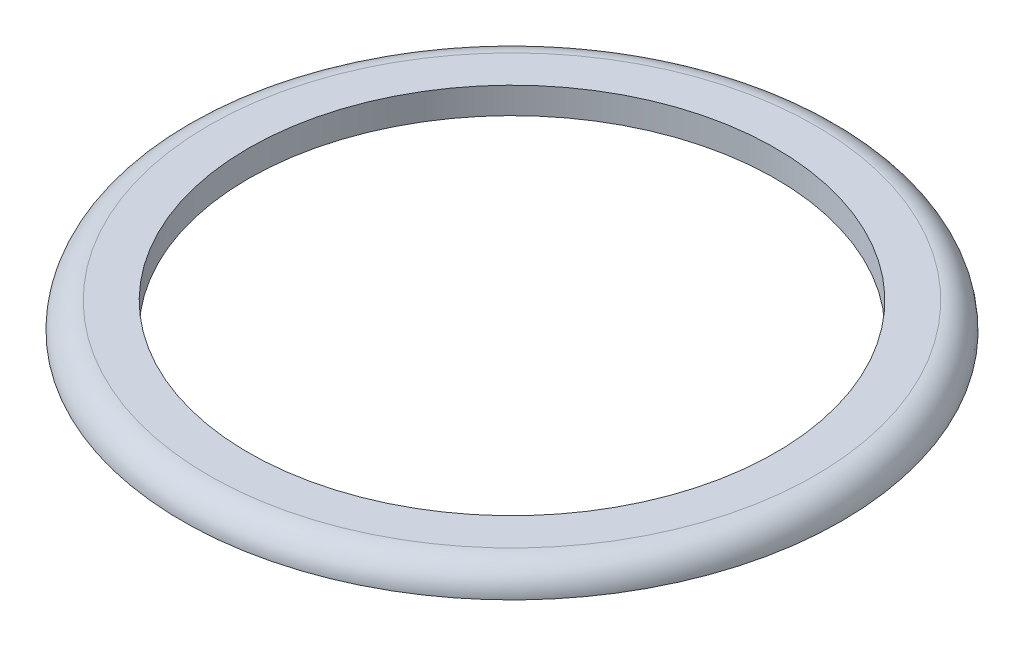
ISO-10303-21;
HEADER;
FILE_DESCRIPTION(('STEP AP214'),'2;1');
FILE_NAME('part.step','',(''),(''),'','','');
FILE_SCHEMA(('AUTOMOTIVE_DESIGN { 1 0 10303 214 1 1 1 1 }'));
ENDSEC;
DATA;
#1=APPLICATION_CONTEXT('core data for automotive mechanical design processes');
#2=APPLICATION_PROTOCOL_DEFINITION('international standard','automotive_design',2000,#1);
#3=PRODUCT_CONTEXT('',#1,'mechanical');
#4=PRODUCT('Part','Part','',(#3));
#5=PRODUCT_RELATED_PRODUCT_CATEGORY('part','',(#4));
#6=PRODUCT_DEFINITION_FORMATION('','',#4);
#7=PRODUCT_DEFINITION_CONTEXT('part definition',#1,'design');
#8=PRODUCT_DEFINITION('design','',#6,#7);
#9=PRODUCT_DEFINITION_SHAPE('','',#8);
#10=(LENGTH_UNIT() NAMED_UNIT(*) SI_UNIT(.MILLI.,.METRE.));
#11=(NAMED_UNIT(*) PLANE_ANGLE_UNIT() SI_UNIT($,.RADIAN.));
#12=(NAMED_UNIT(*) SI_UNIT($,.STERADIAN.) SOLID_ANGLE_UNIT());
#13=UNCERTAINTY_MEASURE_WITH_UNIT(LENGTH_MEASURE(1.E-05),#10,'distance_accuracy_value','');
#14=(GEOMETRIC_REPRESENTATION_CONTEXT(3) GLOBAL_UNCERTAINTY_ASSIGNED_CONTEXT((#13)) GLOBAL_UNIT_ASSIGNED_CONTEXT((#10,
#11,#12)) REPRESENTATION_CONTEXT('',''));
#15=CARTESIAN_POINT('',(0.,0.,0.));
#16=DIRECTION('',(0.,0.,1.));
#17=DIRECTION('',(1.,0.,0.));
#18=AXIS2_PLACEMENT_3D('',#15,#16,#17);
#19=CARTESIAN_POINT('',(2.54,1.65,2.33));
#20=DIRECTION('',(0.,1.,0.));
#21=DIRECTION('',(0.,0.,1.));
#22=AXIS2_PLACEMENT_3D('',#19,#20,#21);
#23=TOROIDAL_SURFACE('',#22,1.15,0.1);
#24=CARTESIAN_POINT('',(2.54,1.65,2.33));
#25=DIRECTION('',(0.,1.,0.));
#26=DIRECTION('',(-1.,0.,0.));
#27=AXIS2_PLACEMENT_3D('',#24,#25,#26);
#28=CIRCLE('',#27,1.25);
#29=CARTESIAN_POINT('',(1.29,1.65,2.33));
#30=VERTEX_POINT('',#29);
#31=EDGE_CURVE('E23',#30,#30,#28,.T.);
#32=ORIENTED_EDGE('',*,*,#31,.T.);
#33=EDGE_LOOP('',(#32));
#34=FACE_BOUND('',#33,.T.);
#35=CARTESIAN_POINT('',(2.54,1.75,2.33));
#36=DIRECTION('',(0.,-1.,0.));
#37=DIRECTION('',(-1.,0.,0.));
#38=AXIS2_PLACEMENT_3D('',#35,#36,#37);
#39=CIRCLE('',#38,1.15);
#40=CARTESIAN_POINT('',(1.39,1.75,2.33));
#41=VERTEX_POINT('',#40);
#42=EDGE_CURVE('E10',#41,#41,#39,.T.);
#43=ORIENTED_EDGE('',*,*,#42,.T.);
#44=EDGE_LOOP('',(#43));
#45=FACE_BOUND('',#44,.T.);
#46=ADVANCED_FACE('F15',(#34,#45),#23,.T.);
#47=CARTESIAN_POINT('',(2.54,1.75,2.33));
#48=DIRECTION('',(0.,1.,0.));
#49=DIRECTION('',(-1.,0.,0.));
#50=AXIS2_PLACEMENT_3D('',#47,#48,#49);
#51=PLANE('',#50);
#52=ORIENTED_EDGE('',*,*,#42,.F.);
#53=EDGE_LOOP('',(#52));
#54=FACE_BOUND('',#53,.T.);
#55=CARTESIAN_POINT('',(2.54,1.75,2.33));
#56=DIRECTION('',(0.,-1.,0.));
#57=DIRECTION('',(-1.,0.,0.));
#58=AXIS2_PLACEMENT_3D('',#55,#56,#57);
#59=CIRCLE('',#58,1.);
#60=CARTESIAN_POINT('',(1.54,1.75,2.33));
#61=VERTEX_POINT('',#60);
#62=EDGE_CURVE('E28',#61,#61,#59,.T.);
#63=ORIENTED_EDGE('',*,*,#62,.T.);
#64=EDGE_LOOP('',(#63));
#65=FACE_BOUND('',#64,.T.);
#66=ADVANCED_FACE('F45',(#54,#65),#51,.T.);
#67=CARTESIAN_POINT('',(2.54,1.65,2.33));
#68=DIRECTION('',(0.,1.,0.));
#69=DIRECTION('',(-1.,0.,0.));
#70=AXIS2_PLACEMENT_3D('',#67,#68,#69);
#71=CYLINDRICAL_SURFACE('',#70,1.);
#72=CARTESIAN_POINT('',(2.54,1.65,2.33));
#73=DIRECTION('',(0.,-1.,0.));
#74=DIRECTION('',(-1.,0.,0.));
#75=AXIS2_PLACEMENT_3D('',#72,#73,#74);
#76=CIRCLE('',#75,1.);
#77=CARTESIAN_POINT('',(1.54,1.65,2.33));
#78=VERTEX_POINT('',#77);
#79=EDGE_CURVE('E19',#78,#78,#76,.T.);
#80=ORIENTED_EDGE('',*,*,#79,.T.);
#81=EDGE_LOOP('',(#80));
#82=FACE_BOUND('',#81,.T.);
#83=ORIENTED_EDGE('',*,*,#62,.F.);
#84=EDGE_LOOP('',(#83));
#85=FACE_BOUND('',#84,.T.);
#86=ADVANCED_FACE('F36',(#82,#85),#71,.F.);
#87=CARTESIAN_POINT('',(2.54,1.65,2.33));
#88=DIRECTION('',(0.,1.,0.));
#89=DIRECTION('',(-1.,0.,0.));
#90=AXIS2_PLACEMENT_3D('',#87,#88,#89);
#91=PLANE('',#90);
#92=ORIENTED_EDGE('',*,*,#31,.F.);
#93=EDGE_LOOP('',(#92));
#94=FACE_BOUND('',#93,.T.);
#95=ORIENTED_EDGE('',*,*,#79,.F.);
#96=EDGE_LOOP('',(#95));
#97=FACE_BOUND('',#96,.T.);
#98=ADVANCED_FACE('F17',(#94,#97),#91,.F.);
#99=CLOSED_SHELL('',(#46,#66,#86,#98));
#100=MANIFOLD_SOLID_BREP('B1',#99);
#101=ADVANCED_BREP_SHAPE_REPRESENTATION('',(#18,#100),#14);
#102=SHAPE_DEFINITION_REPRESENTATION(#9,#101);
ENDSEC;
END-ISO-10303-21;
